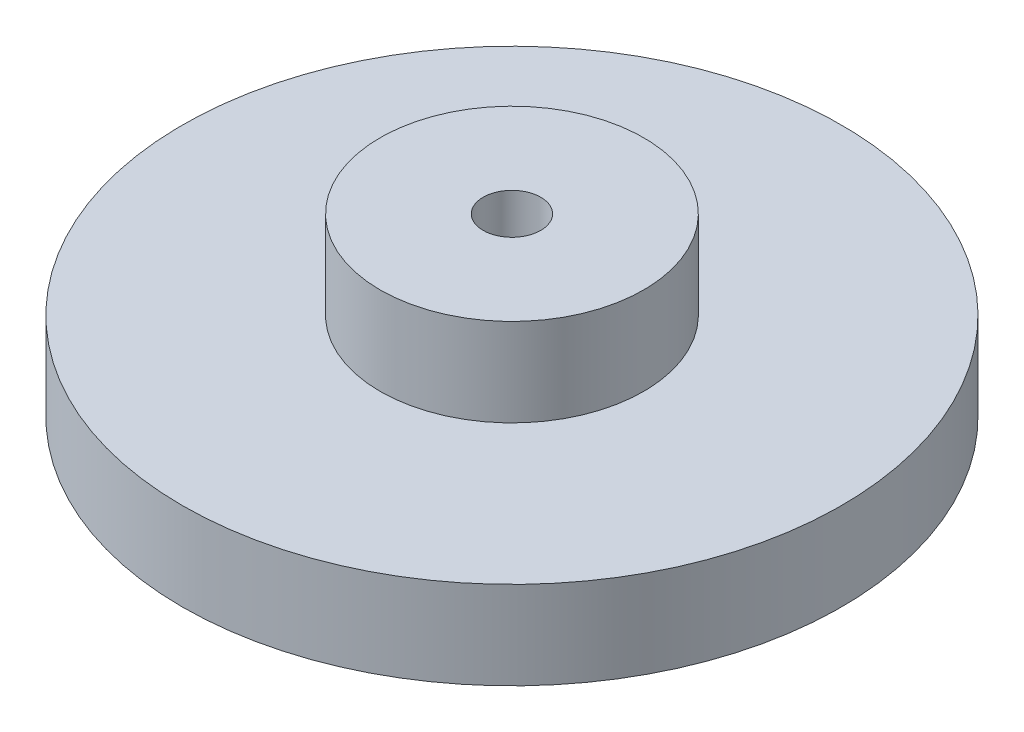
ISO-10303-21;
HEADER;
FILE_DESCRIPTION(('STEP AP214'),'2;1');
FILE_NAME('part.step','',(''),(''),'','','');
FILE_SCHEMA(('AUTOMOTIVE_DESIGN { 1 0 10303 214 1 1 1 1 }'));
ENDSEC;
DATA;
#1=APPLICATION_CONTEXT('core data for automotive mechanical design processes');
#2=APPLICATION_PROTOCOL_DEFINITION('international standard','automotive_design',2000,#1);
#3=PRODUCT_CONTEXT('',#1,'mechanical');
#4=PRODUCT('Part','Part','',(#3));
#5=PRODUCT_RELATED_PRODUCT_CATEGORY('part','',(#4));
#6=PRODUCT_DEFINITION_FORMATION('','',#4);
#7=PRODUCT_DEFINITION_CONTEXT('part definition',#1,'design');
#8=PRODUCT_DEFINITION('design','',#6,#7);
#9=PRODUCT_DEFINITION_SHAPE('','',#8);
#10=(LENGTH_UNIT() NAMED_UNIT(*) SI_UNIT(.MILLI.,.METRE.));
#11=(NAMED_UNIT(*) PLANE_ANGLE_UNIT() SI_UNIT($,.RADIAN.));
#12=(NAMED_UNIT(*) SI_UNIT($,.STERADIAN.) SOLID_ANGLE_UNIT());
#13=UNCERTAINTY_MEASURE_WITH_UNIT(LENGTH_MEASURE(1.E-05),#10,'distance_accuracy_value','');
#14=(GEOMETRIC_REPRESENTATION_CONTEXT(3) GLOBAL_UNCERTAINTY_ASSIGNED_CONTEXT((#13)) GLOBAL_UNIT_ASSIGNED_CONTEXT((#10,
#11,#12)) REPRESENTATION_CONTEXT('',''));
#15=CARTESIAN_POINT('',(0.,0.,0.));
#16=DIRECTION('',(0.,0.,1.));
#17=DIRECTION('',(1.,0.,0.));
#18=AXIS2_PLACEMENT_3D('',#15,#16,#17);
#19=CARTESIAN_POINT('',(0.,2.,0.));
#20=DIRECTION('',(0.,-1.,0.));
#21=DIRECTION('',(0.,0.,-1.));
#22=AXIS2_PLACEMENT_3D('',#19,#20,#21);
#23=CYLINDRICAL_SURFACE('',#22,7.5);
#24=CARTESIAN_POINT('',(0.,2.,0.));
#25=DIRECTION('',(0.,1.,0.));
#26=DIRECTION('',(0.,0.,1.));
#27=AXIS2_PLACEMENT_3D('',#24,#25,#26);
#28=CIRCLE('',#27,7.5);
#29=CARTESIAN_POINT('',(0.,2.,7.5));
#30=VERTEX_POINT('',#29);
#31=EDGE_CURVE('E49',#30,#30,#28,.T.);
#32=ORIENTED_EDGE('',*,*,#31,.F.);
#33=EDGE_LOOP('',(#32));
#34=FACE_BOUND('',#33,.T.);
#35=CARTESIAN_POINT('',(0.,0.,0.));
#36=DIRECTION('',(0.,1.,0.));
#37=DIRECTION('',(0.,0.,1.));
#38=AXIS2_PLACEMENT_3D('',#35,#36,#37);
#39=CIRCLE('',#38,7.5);
#40=CARTESIAN_POINT('',(0.,0.,7.5));
#41=VERTEX_POINT('',#40);
#42=EDGE_CURVE('E44',#41,#41,#39,.T.);
#43=ORIENTED_EDGE('',*,*,#42,.T.);
#44=EDGE_LOOP('',(#43));
#45=FACE_BOUND('',#44,.T.);
#46=ADVANCED_FACE('F41',(#34,#45),#23,.T.);
#47=CARTESIAN_POINT('',(0.,2.,0.));
#48=DIRECTION('',(0.,1.,0.));
#49=DIRECTION('',(0.,0.,1.));
#50=AXIS2_PLACEMENT_3D('',#47,#48,#49);
#51=PLANE('',#50);
#52=CARTESIAN_POINT('',(0.,2.,0.));
#53=DIRECTION('',(0.,1.,0.));
#54=DIRECTION('',(0.,0.,1.));
#55=AXIS2_PLACEMENT_3D('',#52,#53,#54);
#56=CIRCLE('',#55,3.);
#57=CARTESIAN_POINT('',(0.,2.,3.));
#58=VERTEX_POINT('',#57);
#59=EDGE_CURVE('E10',#58,#58,#56,.T.);
#60=ORIENTED_EDGE('',*,*,#59,.F.);
#61=EDGE_LOOP('',(#60));
#62=FACE_BOUND('',#61,.T.);
#63=ORIENTED_EDGE('',*,*,#31,.T.);
#64=EDGE_LOOP('',(#63));
#65=FACE_BOUND('',#64,.T.);
#66=ADVANCED_FACE('F94',(#62,#65),#51,.T.);
#67=CARTESIAN_POINT('',(0.,0.,0.));
#68=DIRECTION('',(0.,1.,0.));
#69=DIRECTION('',(0.,0.,1.));
#70=AXIS2_PLACEMENT_3D('',#67,#68,#69);
#71=PLANE('',#70);
#72=CARTESIAN_POINT('',(0.,0.,0.));
#73=DIRECTION('',(0.,1.,0.));
#74=DIRECTION('',(0.,0.,1.));
#75=AXIS2_PLACEMENT_3D('',#72,#73,#74);
#76=CIRCLE('',#75,2.57757639640146);
#77=CARTESIAN_POINT('',(0.,0.,2.57757639640146));
#78=VERTEX_POINT('',#77);
#79=EDGE_CURVE('E64',#78,#78,#76,.T.);
#80=ORIENTED_EDGE('',*,*,#79,.T.);
#81=EDGE_LOOP('',(#80));
#82=FACE_BOUND('',#81,.T.);
#83=ORIENTED_EDGE('',*,*,#42,.F.);
#84=EDGE_LOOP('',(#83));
#85=FACE_BOUND('',#84,.T.);
#86=ADVANCED_FACE('F89',(#82,#85),#71,.F.);
#87=CARTESIAN_POINT('',(0.,4.,0.));
#88=DIRECTION('',(0.,-1.,0.));
#89=DIRECTION('',(0.,0.,-1.));
#90=AXIS2_PLACEMENT_3D('',#87,#88,#89);
#91=CYLINDRICAL_SURFACE('',#90,3.);
#92=CARTESIAN_POINT('',(0.,4.,0.));
#93=DIRECTION('',(0.,1.,0.));
#94=DIRECTION('',(0.,0.,1.));
#95=AXIS2_PLACEMENT_3D('',#92,#93,#94);
#96=CIRCLE('',#95,3.);
#97=CARTESIAN_POINT('',(0.,4.,3.));
#98=VERTEX_POINT('',#97);
#99=EDGE_CURVE('E56',#98,#98,#96,.T.);
#100=ORIENTED_EDGE('',*,*,#99,.F.);
#101=EDGE_LOOP('',(#100));
#102=FACE_BOUND('',#101,.T.);
#103=ORIENTED_EDGE('',*,*,#59,.T.);
#104=EDGE_LOOP('',(#103));
#105=FACE_BOUND('',#104,.T.);
#106=ADVANCED_FACE('F84',(#102,#105),#91,.T.);
#107=CARTESIAN_POINT('',(0.,4.,0.));
#108=DIRECTION('',(0.,1.,0.));
#109=DIRECTION('',(0.,0.,1.));
#110=AXIS2_PLACEMENT_3D('',#107,#108,#109);
#111=PLANE('',#110);
#112=CARTESIAN_POINT('',(0.,4.,0.));
#113=DIRECTION('',(0.,1.,0.));
#114=DIRECTION('',(0.,0.,1.));
#115=AXIS2_PLACEMENT_3D('',#112,#113,#114);
#116=CIRCLE('',#115,0.655);
#117=CARTESIAN_POINT('',(0.,4.,0.655));
#118=VERTEX_POINT('',#117);
#119=EDGE_CURVE('E60',#118,#118,#116,.T.);
#120=ORIENTED_EDGE('',*,*,#119,.F.);
#121=EDGE_LOOP('',(#120));
#122=FACE_BOUND('',#121,.T.);
#123=ORIENTED_EDGE('',*,*,#99,.T.);
#124=EDGE_LOOP('',(#123));
#125=FACE_BOUND('',#124,.T.);
#126=ADVANCED_FACE('F78',(#122,#125),#111,.T.);
#127=CARTESIAN_POINT('',(0.,1.11,0.));
#128=DIRECTION('',(0.,1.,0.));
#129=DIRECTION('',(0.,0.,1.));
#130=AXIS2_PLACEMENT_3D('',#127,#128,#129);
#131=CYLINDRICAL_SURFACE('',#130,0.655);
#132=CARTESIAN_POINT('',(0.,1.11,0.));
#133=DIRECTION('',(0.,1.,0.));
#134=DIRECTION('',(0.,0.,1.));
#135=AXIS2_PLACEMENT_3D('',#132,#133,#134);
#136=CIRCLE('',#135,0.655);
#137=CARTESIAN_POINT('',(0.,1.11,0.655));
#138=VERTEX_POINT('',#137);
#139=EDGE_CURVE('E68',#138,#138,#136,.T.);
#140=ORIENTED_EDGE('',*,*,#139,.F.);
#141=EDGE_LOOP('',(#140));
#142=FACE_BOUND('',#141,.T.);
#143=ORIENTED_EDGE('',*,*,#119,.T.);
#144=EDGE_LOOP('',(#143));
#145=FACE_BOUND('',#144,.T.);
#146=ADVANCED_FACE('F75',(#142,#145),#131,.F.);
#147=CARTESIAN_POINT('',(0.,1.11,0.));
#148=DIRECTION('',(0.,-1.,0.));
#149=DIRECTION('',(0.,0.,1.));
#150=AXIS2_PLACEMENT_3D('',#147,#148,#149);
#151=CONICAL_SURFACE('',#150,0.655,1.0471975511966);
#152=CARTESIAN_POINT('',(0.,0.,2.57757639640146));
#153=CARTESIAN_POINT('',(0.,0.0115625000000002,2.55754955893895));
#154=CARTESIAN_POINT('',(0.,0.0231250000000001,2.53752272147643));
#155=CARTESIAN_POINT('',(0.,0.04625,2.4974690465514));
#156=CARTESIAN_POINT('',(0.,0.0578124999999999,2.47744220908889));
#157=CARTESIAN_POINT('',(0.,0.0809374999999999,2.43738853416386));
#158=CARTESIAN_POINT('',(0.,0.0925000000000001,2.41736169670134));
#159=CARTESIAN_POINT('',(0.,0.115625,2.37730802177631));
#160=CARTESIAN_POINT('',(0.,0.1271875,2.3572811843138));
#161=CARTESIAN_POINT('',(0.,0.1503125,2.31722750938877));
#162=CARTESIAN_POINT('',(0.,0.161875,2.29720067192625));
#163=CARTESIAN_POINT('',(0.,0.185,2.25714699700122));
#164=CARTESIAN_POINT('',(0.,0.1965625,2.2371201595387));
#165=CARTESIAN_POINT('',(0.,0.2196875,2.19706648461367));
#166=CARTESIAN_POINT('',(0.,0.23125,2.17703964715116));
#167=CARTESIAN_POINT('',(0.,0.254375,2.13698597222613));
#168=CARTESIAN_POINT('',(0.,0.2659375,2.11695913476361));
#169=CARTESIAN_POINT('',(0.,0.2890625,2.07690545983858));
#170=CARTESIAN_POINT('',(0.,0.300625,2.05687862237607));
#171=CARTESIAN_POINT('',(0.,0.32375,2.01682494745104));
#172=CARTESIAN_POINT('',(0.,0.3353125,1.99679810998852));
#173=CARTESIAN_POINT('',(0.,0.3584375,1.95674443506349));
#174=CARTESIAN_POINT('',(0.,0.37,1.93671759760098));
#175=CARTESIAN_POINT('',(0.,0.393125,1.89666392267595));
#176=CARTESIAN_POINT('',(0.,0.4046875,1.87663708521343));
#177=CARTESIAN_POINT('',(0.,0.4278125,1.8365834102884));
#178=CARTESIAN_POINT('',(0.,0.439375,1.81655657282588));
#179=CARTESIAN_POINT('',(0.,0.4625,1.77650289790085));
#180=CARTESIAN_POINT('',(0.,0.4740625,1.75647606043834));
#181=CARTESIAN_POINT('',(0.,0.4971875,1.71642238551331));
#182=CARTESIAN_POINT('',(0.,0.50875,1.69639554805079));
#183=CARTESIAN_POINT('',(0.,0.531875,1.65634187312576));
#184=CARTESIAN_POINT('',(0.,0.5434375,1.63631503566325));
#185=CARTESIAN_POINT('',(0.,0.5665625,1.59626136073822));
#186=CARTESIAN_POINT('',(0.,0.578125,1.5762345232757));
#187=CARTESIAN_POINT('',(0.,0.60125,1.53618084835067));
#188=CARTESIAN_POINT('',(0.,0.6128125,1.51615401088816));
#189=CARTESIAN_POINT('',(0.,0.6359375,1.47610033596313));
#190=CARTESIAN_POINT('',(0.,0.6475,1.45607349850061));
#191=CARTESIAN_POINT('',(0.,0.670625,1.41601982357558));
#192=CARTESIAN_POINT('',(0.,0.6821875,1.39599298611306));
#193=CARTESIAN_POINT('',(0.,0.7053125,1.35593931118803));
#194=CARTESIAN_POINT('',(0.,0.716875,1.33591247372552));
#195=CARTESIAN_POINT('',(0.,0.74,1.29585879880049));
#196=CARTESIAN_POINT('',(0.,0.7515625,1.27583196133797));
#197=CARTESIAN_POINT('',(0.,0.7746875,1.23577828641294));
#198=CARTESIAN_POINT('',(0.,0.78625,1.21575144895043));
#199=CARTESIAN_POINT('',(0.,0.809375,1.1756977740254));
#200=CARTESIAN_POINT('',(0.,0.8209375,1.15567093656288));
#201=CARTESIAN_POINT('',(0.,0.8440625,1.11561726163785));
#202=CARTESIAN_POINT('',(0.,0.855625,1.09559042417534));
#203=CARTESIAN_POINT('',(0.,0.87875,1.0555367492503));
#204=CARTESIAN_POINT('',(0.,0.8903125,1.03550991178779));
#205=CARTESIAN_POINT('',(0.,0.9134375,0.995456236862759));
#206=CARTESIAN_POINT('',(0.,0.925,0.975429399400244));
#207=CARTESIAN_POINT('',(0.,0.948125,0.935375724475213));
#208=CARTESIAN_POINT('',(0.,0.9596875,0.915348887012698));
#209=CARTESIAN_POINT('',(0.,0.9828125,0.875295212087668));
#210=CARTESIAN_POINT('',(0.,0.994375,0.855268374625152));
#211=CARTESIAN_POINT('',(0.,1.0175,0.815214699700122));
#212=CARTESIAN_POINT('',(0.,1.0290625,0.795187862237607));
#213=CARTESIAN_POINT('',(0.,1.0521875,0.755134187312576));
#214=CARTESIAN_POINT('',(0.,1.06375,0.735107349850061));
#215=CARTESIAN_POINT('',(0.,1.086875,0.69505367492503));
#216=CARTESIAN_POINT('',(0.,1.0984375,0.675026837462515));
#217=CARTESIAN_POINT('',(0.,1.11,0.655));
#218=B_SPLINE_CURVE_WITH_KNOTS('',3,(#152,#153,#154,#155,#156,#157,#158,#159,#160,#161,#162,
#163,#164,#165,#166,#167,#168,#169,#170,#171,#172,#173,#174,#175,#176,#177,#178,#179,#180,#181,
#182,#183,#184,#185,#186,#187,#188,#189,#190,#191,#192,#193,#194,#195,#196,#197,#198,#199,#200,
#201,#202,#203,#204,#205,#206,#207,#208,#209,#210,#211,#212,#213,#214,#215,#216,#217),
.UNSPECIFIED.,.F.,.F.,(4,2,2,2,2,2,2,2,2,2,2,2,2,2,2,2,2,2,2,2,2,2,2,2,2,2,2,2,2,2,2,2,4),(0.,
0.0693749999999999,0.13875,0.208125,0.277500000000001,0.346875000000001,0.416250000000001,
0.485625000000002,0.555000000000002,0.624375000000002,0.693750000000002,0.763125000000003,
0.832500000000003,0.901875000000003,0.971250000000004,1.040625,1.11,1.179375,1.24875,1.318125,
1.3875,1.45687500000001,1.52625000000001,1.59562500000001,1.66500000000001,1.73437500000001,
1.80375000000001,1.87312500000001,1.94250000000001,2.01187500000001,2.08125000000001,
2.15062500000001,2.22000000000001),.UNSPECIFIED.);
#219=EDGE_CURVE('BSEAM73',#78,#138,#218,.T.);
#220=ORIENTED_EDGE('',*,*,#79,.F.);
#221=ORIENTED_EDGE('',*,*,#139,.T.);
#222=ORIENTED_EDGE('',*,*,#219,.T.);
#223=ORIENTED_EDGE('',*,*,#219,.F.);
#224=EDGE_LOOP('',(#220,#222,#221,#223));
#225=FACE_BOUND('',#224,.T.);
#226=ADVANCED_FACE('F73',(#225),#151,.F.);
#227=CLOSED_SHELL('',(#46,#66,#86,#106,#126,#146,#226));
#228=MANIFOLD_SOLID_BREP('B2',#227);
#229=ADVANCED_BREP_SHAPE_REPRESENTATION('',(#18,#228),#14);
#230=SHAPE_DEFINITION_REPRESENTATION(#9,#229);
ENDSEC;
END-ISO-10303-21;
